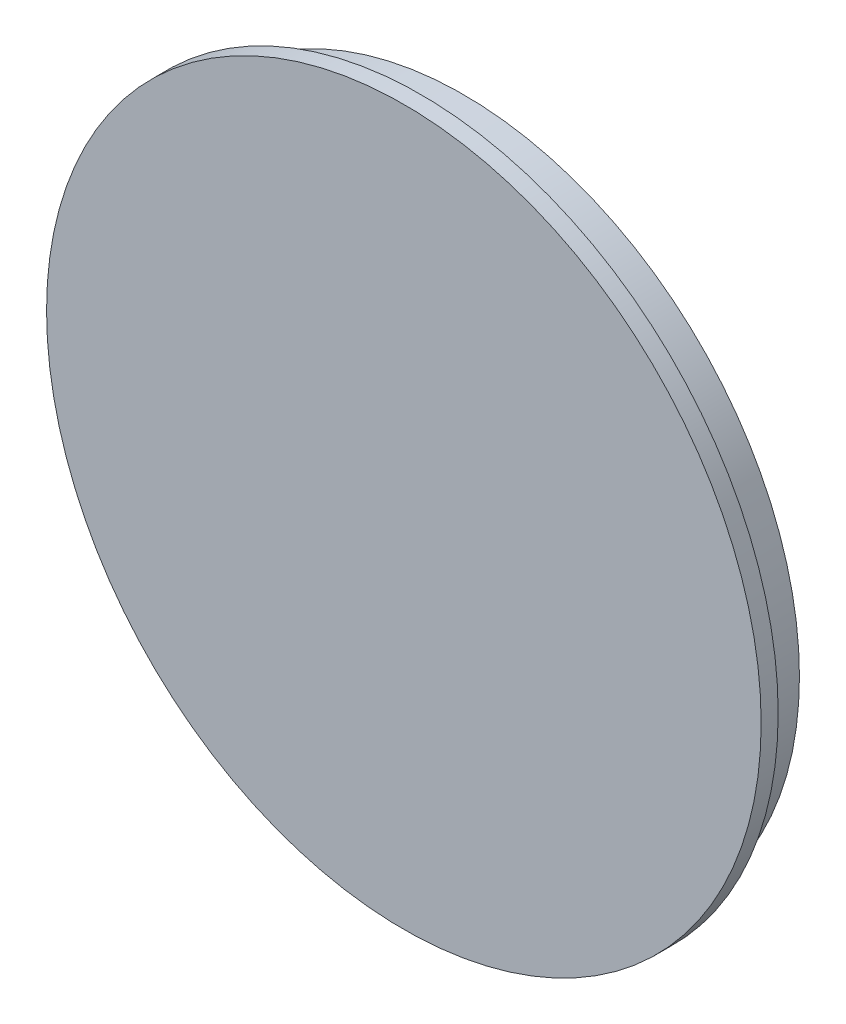
ISO-10303-21;
HEADER;
FILE_DESCRIPTION(('STEP AP214'),'2;1');
FILE_NAME('part.step','',(''),(''),'','','');
FILE_SCHEMA(('AUTOMOTIVE_DESIGN { 1 0 10303 214 1 1 1 1 }'));
ENDSEC;
DATA;
#1=APPLICATION_CONTEXT('core data for automotive mechanical design processes');
#2=APPLICATION_PROTOCOL_DEFINITION('international standard','automotive_design',2000,#1);
#3=PRODUCT_CONTEXT('',#1,'mechanical');
#4=PRODUCT('Part','Part','',(#3));
#5=PRODUCT_RELATED_PRODUCT_CATEGORY('part','',(#4));
#6=PRODUCT_DEFINITION_FORMATION('','',#4);
#7=PRODUCT_DEFINITION_CONTEXT('part definition',#1,'design');
#8=PRODUCT_DEFINITION('design','',#6,#7);
#9=PRODUCT_DEFINITION_SHAPE('','',#8);
#10=(LENGTH_UNIT() NAMED_UNIT(*) SI_UNIT(.MILLI.,.METRE.));
#11=(NAMED_UNIT(*) PLANE_ANGLE_UNIT() SI_UNIT($,.RADIAN.));
#12=(NAMED_UNIT(*) SI_UNIT($,.STERADIAN.) SOLID_ANGLE_UNIT());
#13=UNCERTAINTY_MEASURE_WITH_UNIT(LENGTH_MEASURE(1.E-05),#10,'distance_accuracy_value','');
#14=(GEOMETRIC_REPRESENTATION_CONTEXT(3) GLOBAL_UNCERTAINTY_ASSIGNED_CONTEXT((#13)) GLOBAL_UNIT_ASSIGNED_CONTEXT((#10,
#11,#12)) REPRESENTATION_CONTEXT('',''));
#15=CARTESIAN_POINT('',(0.,0.,0.));
#16=DIRECTION('',(0.,0.,1.));
#17=DIRECTION('',(1.,0.,0.));
#18=AXIS2_PLACEMENT_3D('',#15,#16,#17);
#19=CARTESIAN_POINT('',(0.,0.,0.));
#20=DIRECTION('',(0.,0.,1.));
#21=DIRECTION('',(1.,0.,0.));
#22=AXIS2_PLACEMENT_3D('',#19,#20,#21);
#23=PLANE('',#22);
#24=CARTESIAN_POINT('',(0.,0.,0.));
#25=DIRECTION('',(0.,0.,1.));
#26=DIRECTION('',(1.,0.,0.));
#27=AXIS2_PLACEMENT_3D('',#24,#25,#26);
#28=CIRCLE('',#27,39.5);
#29=CARTESIAN_POINT('',(39.5,0.,0.));
#30=VERTEX_POINT('',#29);
#31=EDGE_CURVE('E55',#30,#30,#28,.T.);
#32=ORIENTED_EDGE('',*,*,#31,.F.);
#33=EDGE_LOOP('',(#32));
#34=FACE_BOUND('',#33,.T.);
#35=CARTESIAN_POINT('',(0.,0.,0.));
#36=DIRECTION('',(0.,0.,1.));
#37=DIRECTION('',(1.,0.,0.));
#38=AXIS2_PLACEMENT_3D('',#35,#36,#37);
#39=CIRCLE('',#38,37.5);
#40=CARTESIAN_POINT('',(37.5,0.,0.));
#41=VERTEX_POINT('',#40);
#42=EDGE_CURVE('E60',#41,#41,#39,.T.);
#43=ORIENTED_EDGE('',*,*,#42,.T.);
#44=EDGE_LOOP('',(#43));
#45=FACE_BOUND('',#44,.T.);
#46=ADVANCED_FACE('F37',(#34,#45),#23,.F.);
#47=CARTESIAN_POINT('',(0.,0.,5.));
#48=DIRECTION('',(0.,0.,-1.));
#49=DIRECTION('',(-1.,0.,0.));
#50=AXIS2_PLACEMENT_3D('',#47,#48,#49);
#51=CYLINDRICAL_SURFACE('',#50,39.5);
#52=CARTESIAN_POINT('',(0.,0.,5.));
#53=DIRECTION('',(0.,0.,1.));
#54=DIRECTION('',(1.,0.,0.));
#55=AXIS2_PLACEMENT_3D('',#52,#53,#54);
#56=CIRCLE('',#55,39.5);
#57=CARTESIAN_POINT('',(39.5,0.,5.));
#58=VERTEX_POINT('',#57);
#59=EDGE_CURVE('E50',#58,#58,#56,.T.);
#60=ORIENTED_EDGE('',*,*,#59,.F.);
#61=EDGE_LOOP('',(#60));
#62=FACE_BOUND('',#61,.T.);
#63=ORIENTED_EDGE('',*,*,#31,.T.);
#64=EDGE_LOOP('',(#63));
#65=FACE_BOUND('',#64,.T.);
#66=ADVANCED_FACE('F96',(#62,#65),#51,.T.);
#67=CARTESIAN_POINT('',(0.,0.,5.));
#68=DIRECTION('',(0.,0.,-1.));
#69=DIRECTION('',(-1.,0.,0.));
#70=AXIS2_PLACEMENT_3D('',#67,#68,#69);
#71=CYLINDRICAL_SURFACE('',#70,37.5);
#72=CARTESIAN_POINT('',(0.,0.,3.));
#73=DIRECTION('',(0.,0.,1.));
#74=DIRECTION('',(1.,0.,0.));
#75=AXIS2_PLACEMENT_3D('',#72,#73,#74);
#76=CIRCLE('',#75,37.5);
#77=CARTESIAN_POINT('',(37.5,0.,3.));
#78=VERTEX_POINT('',#77);
#79=EDGE_CURVE('E45',#78,#78,#76,.T.);
#80=ORIENTED_EDGE('',*,*,#79,.T.);
#81=EDGE_LOOP('',(#80));
#82=FACE_BOUND('',#81,.T.);
#83=ORIENTED_EDGE('',*,*,#42,.F.);
#84=EDGE_LOOP('',(#83));
#85=FACE_BOUND('',#84,.T.);
#86=ADVANCED_FACE('F94',(#82,#85),#71,.F.);
#87=CARTESIAN_POINT('',(0.,0.,5.));
#88=DIRECTION('',(0.,0.,1.));
#89=DIRECTION('',(1.,0.,0.));
#90=AXIS2_PLACEMENT_3D('',#87,#88,#89);
#91=PLANE('',#90);
#92=CARTESIAN_POINT('',(0.,0.,5.));
#93=DIRECTION('',(0.,0.,1.));
#94=DIRECTION('',(1.,0.,0.));
#95=AXIS2_PLACEMENT_3D('',#92,#93,#94);
#96=CIRCLE('',#95,35.5);
#97=CARTESIAN_POINT('',(35.5,0.,5.));
#98=VERTEX_POINT('',#97);
#99=EDGE_CURVE('E10',#98,#98,#96,.F.);
#100=ORIENTED_EDGE('',*,*,#99,.T.);
#101=EDGE_LOOP('',(#100));
#102=FACE_BOUND('',#101,.T.);
#103=ADVANCED_FACE('F79',(#102),#91,.F.);
#104=CARTESIAN_POINT('',(0.,0.,7.));
#105=DIRECTION('',(0.,0.,-1.));
#106=DIRECTION('',(-1.,0.,0.));
#107=AXIS2_PLACEMENT_3D('',#104,#105,#106);
#108=CYLINDRICAL_SURFACE('',#107,42.);
#109=CARTESIAN_POINT('',(0.,0.,7.));
#110=DIRECTION('',(0.,0.,1.));
#111=DIRECTION('',(1.,0.,0.));
#112=AXIS2_PLACEMENT_3D('',#109,#110,#111);
#113=CIRCLE('',#112,42.);
#114=CARTESIAN_POINT('',(42.,0.,7.));
#115=VERTEX_POINT('',#114);
#116=EDGE_CURVE('E65',#115,#115,#113,.T.);
#117=ORIENTED_EDGE('',*,*,#116,.F.);
#118=EDGE_LOOP('',(#117));
#119=FACE_BOUND('',#118,.T.);
#120=CARTESIAN_POINT('',(0.,0.,5.));
#121=DIRECTION('',(0.,0.,1.));
#122=DIRECTION('',(1.,0.,0.));
#123=AXIS2_PLACEMENT_3D('',#120,#121,#122);
#124=CIRCLE('',#123,42.);
#125=CARTESIAN_POINT('',(42.,0.,5.));
#126=VERTEX_POINT('',#125);
#127=EDGE_CURVE('E66',#126,#126,#124,.T.);
#128=ORIENTED_EDGE('',*,*,#127,.T.);
#129=EDGE_LOOP('',(#128));
#130=FACE_BOUND('',#129,.T.);
#131=ADVANCED_FACE('F76',(#119,#130),#108,.T.);
#132=CARTESIAN_POINT('',(0.,0.,7.));
#133=DIRECTION('',(0.,0.,1.));
#134=DIRECTION('',(1.,0.,0.));
#135=AXIS2_PLACEMENT_3D('',#132,#133,#134);
#136=PLANE('',#135);
#137=ORIENTED_EDGE('',*,*,#116,.T.);
#138=EDGE_LOOP('',(#137));
#139=FACE_BOUND('',#138,.T.);
#140=ADVANCED_FACE('F74',(#139),#136,.T.);
#141=ORIENTED_EDGE('',*,*,#59,.T.);
#142=EDGE_LOOP('',(#141));
#143=FACE_BOUND('',#142,.T.);
#144=ORIENTED_EDGE('',*,*,#127,.F.);
#145=EDGE_LOOP('',(#144));
#146=FACE_BOUND('',#145,.T.);
#147=ADVANCED_FACE('F83',(#143,#146),#91,.F.);
#148=CARTESIAN_POINT('',(0.,0.,3.));
#149=DIRECTION('',(0.,0.,1.));
#150=DIRECTION('',(1.,0.,0.));
#151=AXIS2_PLACEMENT_3D('',#148,#149,#150);
#152=TOROIDAL_SURFACE('',#151,35.5,2.);
#153=ORIENTED_EDGE('',*,*,#99,.F.);
#154=EDGE_LOOP('',(#153));
#155=FACE_BOUND('',#154,.T.);
#156=ORIENTED_EDGE('',*,*,#79,.F.);
#157=EDGE_LOOP('',(#156));
#158=FACE_BOUND('',#157,.T.);
#159=ADVANCED_FACE('F39',(#155,#158),#152,.F.);
#160=CLOSED_SHELL('',(#46,#66,#86,#103,#131,#140,#147,#159));
#161=MANIFOLD_SOLID_BREP('B2',#160);
#162=ADVANCED_BREP_SHAPE_REPRESENTATION('',(#18,#161),#14);
#163=SHAPE_DEFINITION_REPRESENTATION(#9,#162);
ENDSEC;
END-ISO-10303-21;
